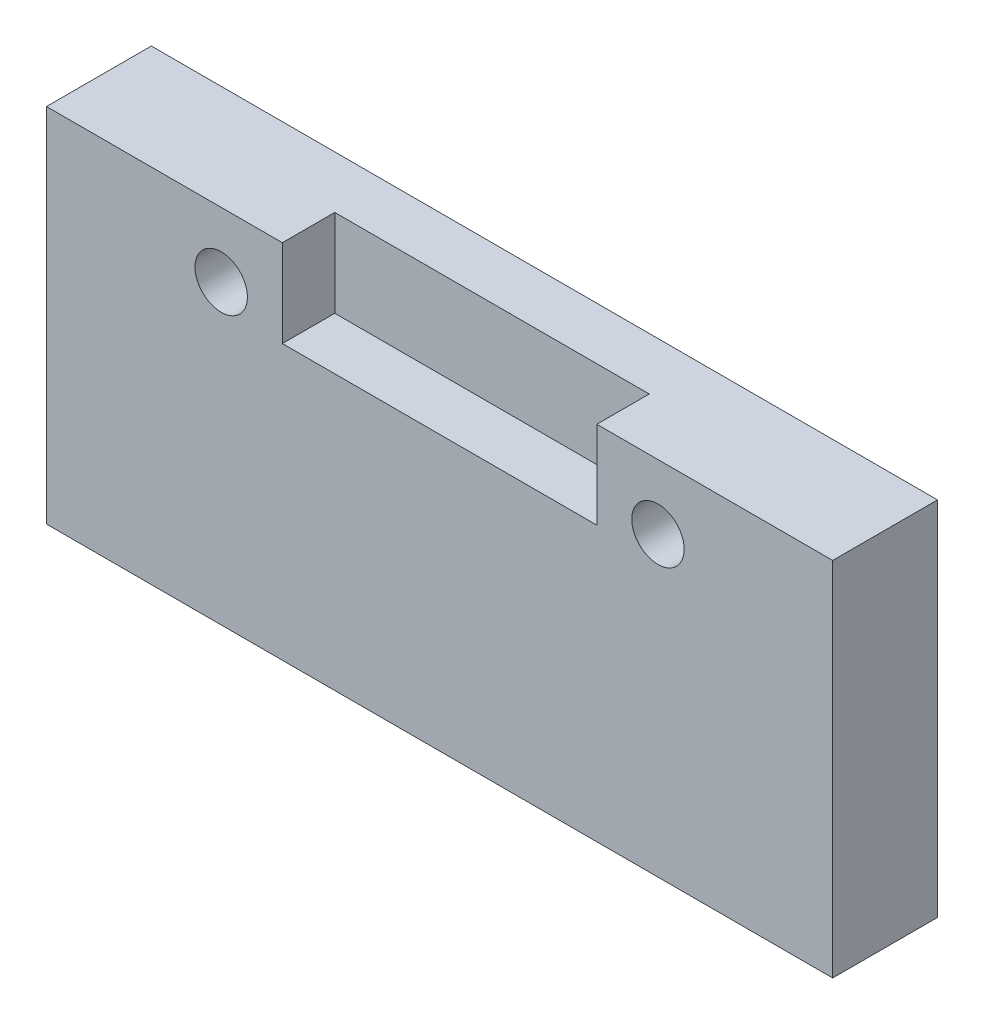
ISO-10303-21;
HEADER;
FILE_DESCRIPTION(('STEP AP214'),'2;1');
FILE_NAME('part.step','',(''),(''),'','','');
FILE_SCHEMA(('AUTOMOTIVE_DESIGN { 1 0 10303 214 1 1 1 1 }'));
ENDSEC;
DATA;
#1=APPLICATION_CONTEXT('core data for automotive mechanical design processes');
#2=APPLICATION_PROTOCOL_DEFINITION('international standard','automotive_design',2000,#1);
#3=PRODUCT_CONTEXT('',#1,'mechanical');
#4=PRODUCT('Part','Part','',(#3));
#5=PRODUCT_RELATED_PRODUCT_CATEGORY('part','',(#4));
#6=PRODUCT_DEFINITION_FORMATION('','',#4);
#7=PRODUCT_DEFINITION_CONTEXT('part definition',#1,'design');
#8=PRODUCT_DEFINITION('design','',#6,#7);
#9=PRODUCT_DEFINITION_SHAPE('','',#8);
#10=(LENGTH_UNIT() NAMED_UNIT(*) SI_UNIT(.MILLI.,.METRE.));
#11=(NAMED_UNIT(*) PLANE_ANGLE_UNIT() SI_UNIT($,.RADIAN.));
#12=(NAMED_UNIT(*) SI_UNIT($,.STERADIAN.) SOLID_ANGLE_UNIT());
#13=UNCERTAINTY_MEASURE_WITH_UNIT(LENGTH_MEASURE(1.E-05),#10,'distance_accuracy_value','');
#14=(GEOMETRIC_REPRESENTATION_CONTEXT(3) GLOBAL_UNCERTAINTY_ASSIGNED_CONTEXT((#13)) GLOBAL_UNIT_ASSIGNED_CONTEXT((#10,
#11,#12)) REPRESENTATION_CONTEXT('',''));
#15=CARTESIAN_POINT('',(0.,0.,0.));
#16=DIRECTION('',(0.,0.,1.));
#17=DIRECTION('',(1.,0.,0.));
#18=AXIS2_PLACEMENT_3D('',#15,#16,#17);
#19=CARTESIAN_POINT('',(0.,0.,6.));
#20=DIRECTION('',(0.,0.,1.));
#21=DIRECTION('',(1.,0.,0.));
#22=AXIS2_PLACEMENT_3D('',#19,#20,#21);
#23=PLANE('',#22);
#24=DIRECTION('',(0.,1.,0.));
#25=VECTOR('',#24,1.);
#26=CARTESIAN_POINT('',(13.0466141577248,7.20600717876717,6.));
#27=LINE('',#26,#25);
#28=CARTESIAN_POINT('',(13.0466141577248,7.20600717876717,6.));
#29=VERTEX_POINT('',#28);
#30=CARTESIAN_POINT('',(13.0466141577248,12.2060071787672,6.));
#31=VERTEX_POINT('',#30);
#32=EDGE_CURVE('E123',#29,#31,#27,.T.);
#33=ORIENTED_EDGE('',*,*,#32,.F.);
#34=DIRECTION('',(1.,0.,0.));
#35=VECTOR('',#34,1.);
#36=CARTESIAN_POINT('',(-4.95338584227521,7.20600717876717,6.));
#37=LINE('',#36,#35);
#38=CARTESIAN_POINT('',(-4.95338584227521,7.20600717876717,6.));
#39=VERTEX_POINT('',#38);
#40=EDGE_CURVE('E284',#39,#29,#37,.T.);
#41=ORIENTED_EDGE('',*,*,#40,.F.);
#42=DIRECTION('',(0.,-1.,0.));
#43=VECTOR('',#42,1.);
#44=CARTESIAN_POINT('',(-4.95338584227522,12.2060071787672,6.));
#45=LINE('',#44,#43);
#46=CARTESIAN_POINT('',(-4.95338584227522,12.2060071787672,6.));
#47=VERTEX_POINT('',#46);
#48=EDGE_CURVE('E289',#47,#39,#45,.T.);
#49=ORIENTED_EDGE('',*,*,#48,.F.);
#50=DIRECTION('',(-1.,0.,0.));
#51=VECTOR('',#50,1.);
#52=CARTESIAN_POINT('',(26.5466141577248,12.2060071787672,6.));
#53=LINE('',#52,#51);
#54=CARTESIAN_POINT('',(-18.4533858422752,12.2060071787672,6.));
#55=VERTEX_POINT('',#54);
#56=EDGE_CURVE('E85',#47,#55,#53,.T.);
#57=ORIENTED_EDGE('',*,*,#56,.T.);
#58=DIRECTION('',(0.,-1.,0.));
#59=VECTOR('',#58,1.);
#60=CARTESIAN_POINT('',(-18.4533858422752,12.2060071787672,6.));
#61=LINE('',#60,#59);
#62=CARTESIAN_POINT('',(-18.4533858422752,-8.49399282123283,6.));
#63=VERTEX_POINT('',#62);
#64=EDGE_CURVE('E148',#55,#63,#61,.T.);
#65=ORIENTED_EDGE('',*,*,#64,.T.);
#66=DIRECTION('',(1.,0.,0.));
#67=VECTOR('',#66,1.);
#68=CARTESIAN_POINT('',(-18.4533858422752,-8.49399282123283,6.));
#69=LINE('',#68,#67);
#70=CARTESIAN_POINT('',(26.5466141577248,-8.49399282123283,6.));
#71=VERTEX_POINT('',#70);
#72=EDGE_CURVE('E150',#63,#71,#69,.T.);
#73=ORIENTED_EDGE('',*,*,#72,.T.);
#74=DIRECTION('',(0.,1.,0.));
#75=VECTOR('',#74,1.);
#76=CARTESIAN_POINT('',(26.5466141577248,-8.49399282123283,6.));
#77=LINE('',#76,#75);
#78=CARTESIAN_POINT('',(26.5466141577248,12.2060071787672,6.));
#79=VERTEX_POINT('',#78);
#80=EDGE_CURVE('E57',#71,#79,#77,.T.);
#81=ORIENTED_EDGE('',*,*,#80,.T.);
#82=EDGE_CURVE('E146',#79,#31,#53,.T.);
#83=ORIENTED_EDGE('',*,*,#82,.T.);
#84=EDGE_LOOP('',(#33,#41,#49,#57,#65,#73,#81,#83));
#85=FACE_BOUND('',#84,.T.);
#86=CARTESIAN_POINT('',(16.5466141577248,8.50600717876716,6.));
#87=DIRECTION('',(0.,0.,1.));
#88=DIRECTION('',(1.,0.,0.));
#89=AXIS2_PLACEMENT_3D('',#86,#87,#88);
#90=CIRCLE('',#89,1.5);
#91=CARTESIAN_POINT('',(18.0466141577248,8.50600717876716,6.));
#92=VERTEX_POINT('',#91);
#93=EDGE_CURVE('E140',#92,#92,#90,.T.);
#94=ORIENTED_EDGE('',*,*,#93,.F.);
#95=EDGE_LOOP('',(#94));
#96=FACE_BOUND('',#95,.T.);
#97=CARTESIAN_POINT('',(-8.45338584227521,8.50600717876716,6.));
#98=DIRECTION('',(0.,0.,1.));
#99=DIRECTION('',(1.,0.,0.));
#100=AXIS2_PLACEMENT_3D('',#97,#98,#99);
#101=CIRCLE('',#100,1.5);
#102=CARTESIAN_POINT('',(-6.95338584227521,8.50600717876716,6.));
#103=VERTEX_POINT('',#102);
#104=EDGE_CURVE('E132',#103,#103,#101,.T.);
#105=ORIENTED_EDGE('',*,*,#104,.F.);
#106=EDGE_LOOP('',(#105));
#107=FACE_BOUND('',#106,.T.);
#108=ADVANCED_FACE('F33',(#85,#96,#107),#23,.T.);
#109=CARTESIAN_POINT('',(0.,0.,0.));
#110=DIRECTION('',(0.,0.,1.));
#111=DIRECTION('',(1.,0.,0.));
#112=AXIS2_PLACEMENT_3D('',#109,#110,#111);
#113=PLANE('',#112);
#114=DIRECTION('',(-1.,0.,0.));
#115=VECTOR('',#114,1.);
#116=CARTESIAN_POINT('',(26.5466141577248,12.2060071787672,0.));
#117=LINE('',#116,#115);
#118=CARTESIAN_POINT('',(26.5466141577248,12.2060071787672,0.));
#119=VERTEX_POINT('',#118);
#120=CARTESIAN_POINT('',(-18.4533858422752,12.2060071787672,0.));
#121=VERTEX_POINT('',#120);
#122=EDGE_CURVE('E143',#119,#121,#117,.T.);
#123=ORIENTED_EDGE('',*,*,#122,.F.);
#124=DIRECTION('',(0.,1.,0.));
#125=VECTOR('',#124,1.);
#126=CARTESIAN_POINT('',(26.5466141577248,-8.49399282123283,0.));
#127=LINE('',#126,#125);
#128=CARTESIAN_POINT('',(26.5466141577248,-8.49399282123283,0.));
#129=VERTEX_POINT('',#128);
#130=EDGE_CURVE('E78',#129,#119,#127,.T.);
#131=ORIENTED_EDGE('',*,*,#130,.F.);
#132=DIRECTION('',(1.,0.,0.));
#133=VECTOR('',#132,1.);
#134=CARTESIAN_POINT('',(-18.4533858422752,-8.49399282123283,0.));
#135=LINE('',#134,#133);
#136=CARTESIAN_POINT('',(-18.4533858422752,-8.49399282123283,0.));
#137=VERTEX_POINT('',#136);
#138=EDGE_CURVE('E158',#137,#129,#135,.T.);
#139=ORIENTED_EDGE('',*,*,#138,.F.);
#140=DIRECTION('',(0.,-1.,0.));
#141=VECTOR('',#140,1.);
#142=CARTESIAN_POINT('',(-18.4533858422752,12.2060071787672,0.));
#143=LINE('',#142,#141);
#144=EDGE_CURVE('E156',#121,#137,#143,.T.);
#145=ORIENTED_EDGE('',*,*,#144,.F.);
#146=EDGE_LOOP('',(#123,#131,#139,#145));
#147=FACE_BOUND('',#146,.T.);
#148=CARTESIAN_POINT('',(16.5466141577248,8.50600717876716,0.));
#149=DIRECTION('',(0.,0.,1.));
#150=DIRECTION('',(1.,0.,0.));
#151=AXIS2_PLACEMENT_3D('',#148,#149,#150);
#152=CIRCLE('',#151,1.5);
#153=CARTESIAN_POINT('',(18.0466141577248,8.50600717876716,0.));
#154=VERTEX_POINT('',#153);
#155=EDGE_CURVE('E135',#154,#154,#152,.T.);
#156=ORIENTED_EDGE('',*,*,#155,.T.);
#157=EDGE_LOOP('',(#156));
#158=FACE_BOUND('',#157,.T.);
#159=CARTESIAN_POINT('',(-8.45338584227521,8.50600717876716,0.));
#160=DIRECTION('',(0.,0.,1.));
#161=DIRECTION('',(1.,0.,0.));
#162=AXIS2_PLACEMENT_3D('',#159,#160,#161);
#163=CIRCLE('',#162,1.5);
#164=CARTESIAN_POINT('',(-6.95338584227521,8.50600717876716,0.));
#165=VERTEX_POINT('',#164);
#166=EDGE_CURVE('E136',#165,#165,#163,.T.);
#167=ORIENTED_EDGE('',*,*,#166,.T.);
#168=EDGE_LOOP('',(#167));
#169=FACE_BOUND('',#168,.T.);
#170=ADVANCED_FACE('F173',(#147,#158,#169),#113,.F.);
#171=CARTESIAN_POINT('',(26.5466141577248,12.2060071787672,6.));
#172=DIRECTION('',(0.,-1.,0.));
#173=DIRECTION('',(1.,0.,0.));
#174=AXIS2_PLACEMENT_3D('',#171,#172,#173);
#175=PLANE('',#174);
#176=DIRECTION('',(-1.,0.,0.));
#177=VECTOR('',#176,1.);
#178=CARTESIAN_POINT('',(13.0466141577248,12.2060071787672,3.));
#179=LINE('',#178,#177);
#180=CARTESIAN_POINT('',(13.0466141577248,12.2060071787672,3.));
#181=VERTEX_POINT('',#180);
#182=CARTESIAN_POINT('',(-4.95338584227522,12.2060071787672,3.));
#183=VERTEX_POINT('',#182);
#184=EDGE_CURVE('E117',#181,#183,#179,.T.);
#185=ORIENTED_EDGE('',*,*,#184,.F.);
#186=DIRECTION('',(0.,0.,1.));
#187=VECTOR('',#186,1.);
#188=CARTESIAN_POINT('',(13.0466141577248,12.2060071787672,3.));
#189=LINE('',#188,#187);
#190=EDGE_CURVE('E139',#181,#31,#189,.T.);
#191=ORIENTED_EDGE('',*,*,#190,.T.);
#192=ORIENTED_EDGE('',*,*,#82,.F.);
#193=DIRECTION('',(0.,0.,-1.));
#194=VECTOR('',#193,1.);
#195=CARTESIAN_POINT('',(26.5466141577248,12.2060071787672,6.));
#196=LINE('',#195,#194);
#197=EDGE_CURVE('E153',#79,#119,#196,.T.);
#198=ORIENTED_EDGE('',*,*,#197,.T.);
#199=ORIENTED_EDGE('',*,*,#122,.T.);
#200=DIRECTION('',(0.,0.,-1.));
#201=VECTOR('',#200,1.);
#202=CARTESIAN_POINT('',(-18.4533858422752,12.2060071787672,6.));
#203=LINE('',#202,#201);
#204=EDGE_CURVE('E11',#55,#121,#203,.T.);
#205=ORIENTED_EDGE('',*,*,#204,.F.);
#206=ORIENTED_EDGE('',*,*,#56,.F.);
#207=DIRECTION('',(0.,0.,1.));
#208=VECTOR('',#207,1.);
#209=CARTESIAN_POINT('',(-4.95338584227522,12.2060071787672,3.));
#210=LINE('',#209,#208);
#211=EDGE_CURVE('E113',#183,#47,#210,.T.);
#212=ORIENTED_EDGE('',*,*,#211,.F.);
#213=EDGE_LOOP('',(#185,#191,#192,#198,#199,#205,#206,#212));
#214=FACE_BOUND('',#213,.T.);
#215=ADVANCED_FACE('F35',(#214),#175,.F.);
#216=CARTESIAN_POINT('',(-18.4533858422752,12.2060071787672,6.));
#217=DIRECTION('',(1.,0.,0.));
#218=DIRECTION('',(0.,0.,-1.));
#219=AXIS2_PLACEMENT_3D('',#216,#217,#218);
#220=PLANE('',#219);
#221=ORIENTED_EDGE('',*,*,#144,.T.);
#222=DIRECTION('',(0.,0.,-1.));
#223=VECTOR('',#222,1.);
#224=CARTESIAN_POINT('',(-18.4533858422752,-8.49399282123283,6.));
#225=LINE('',#224,#223);
#226=EDGE_CURVE('E41',#63,#137,#225,.T.);
#227=ORIENTED_EDGE('',*,*,#226,.F.);
#228=ORIENTED_EDGE('',*,*,#64,.F.);
#229=ORIENTED_EDGE('',*,*,#204,.T.);
#230=EDGE_LOOP('',(#221,#227,#228,#229));
#231=FACE_BOUND('',#230,.T.);
#232=ADVANCED_FACE('F187',(#231),#220,.F.);
#233=CARTESIAN_POINT('',(-18.4533858422752,-8.49399282123283,6.));
#234=DIRECTION('',(0.,1.,0.));
#235=DIRECTION('',(0.,0.,1.));
#236=AXIS2_PLACEMENT_3D('',#233,#234,#235);
#237=PLANE('',#236);
#238=ORIENTED_EDGE('',*,*,#138,.T.);
#239=DIRECTION('',(0.,0.,-1.));
#240=VECTOR('',#239,1.);
#241=CARTESIAN_POINT('',(26.5466141577248,-8.49399282123283,6.));
#242=LINE('',#241,#240);
#243=EDGE_CURVE('E162',#71,#129,#242,.T.);
#244=ORIENTED_EDGE('',*,*,#243,.F.);
#245=ORIENTED_EDGE('',*,*,#72,.F.);
#246=ORIENTED_EDGE('',*,*,#226,.T.);
#247=EDGE_LOOP('',(#238,#244,#245,#246));
#248=FACE_BOUND('',#247,.T.);
#249=ADVANCED_FACE('F168',(#248),#237,.F.);
#250=CARTESIAN_POINT('',(26.5466141577248,-8.49399282123283,6.));
#251=DIRECTION('',(-1.,0.,0.));
#252=DIRECTION('',(0.,0.,1.));
#253=AXIS2_PLACEMENT_3D('',#250,#251,#252);
#254=PLANE('',#253);
#255=ORIENTED_EDGE('',*,*,#130,.T.);
#256=ORIENTED_EDGE('',*,*,#197,.F.);
#257=ORIENTED_EDGE('',*,*,#80,.F.);
#258=ORIENTED_EDGE('',*,*,#243,.T.);
#259=EDGE_LOOP('',(#255,#256,#257,#258));
#260=FACE_BOUND('',#259,.T.);
#261=ADVANCED_FACE('F176',(#260),#254,.F.);
#262=CARTESIAN_POINT('',(16.5466141577248,8.50600717876716,6.));
#263=DIRECTION('',(0.,0.,-1.));
#264=DIRECTION('',(-1.,0.,0.));
#265=AXIS2_PLACEMENT_3D('',#262,#263,#264);
#266=CYLINDRICAL_SURFACE('',#265,1.5);
#267=ORIENTED_EDGE('',*,*,#93,.T.);
#268=EDGE_LOOP('',(#267));
#269=FACE_BOUND('',#268,.T.);
#270=ORIENTED_EDGE('',*,*,#155,.F.);
#271=EDGE_LOOP('',(#270));
#272=FACE_BOUND('',#271,.T.);
#273=ADVANCED_FACE('F178',(#269,#272),#266,.F.);
#274=CARTESIAN_POINT('',(-8.45338584227521,8.50600717876716,6.));
#275=DIRECTION('',(0.,0.,-1.));
#276=DIRECTION('',(-1.,0.,0.));
#277=AXIS2_PLACEMENT_3D('',#274,#275,#276);
#278=CYLINDRICAL_SURFACE('',#277,1.5);
#279=ORIENTED_EDGE('',*,*,#104,.T.);
#280=EDGE_LOOP('',(#279));
#281=FACE_BOUND('',#280,.T.);
#282=ORIENTED_EDGE('',*,*,#166,.F.);
#283=EDGE_LOOP('',(#282));
#284=FACE_BOUND('',#283,.T.);
#285=ADVANCED_FACE('F184',(#281,#284),#278,.F.);
#286=CARTESIAN_POINT('',(13.0466141577248,7.20600717876717,3.));
#287=DIRECTION('',(1.,0.,0.));
#288=DIRECTION('',(0.,1.,0.));
#289=AXIS2_PLACEMENT_3D('',#286,#287,#288);
#290=PLANE('',#289);
#291=ORIENTED_EDGE('',*,*,#32,.T.);
#292=ORIENTED_EDGE('',*,*,#190,.F.);
#293=DIRECTION('',(0.,1.,0.));
#294=VECTOR('',#293,1.);
#295=CARTESIAN_POINT('',(13.0466141577248,7.20600717876717,3.));
#296=LINE('',#295,#294);
#297=CARTESIAN_POINT('',(13.0466141577248,7.20600717876717,3.));
#298=VERTEX_POINT('',#297);
#299=EDGE_CURVE('E48',#298,#181,#296,.T.);
#300=ORIENTED_EDGE('',*,*,#299,.F.);
#301=DIRECTION('',(0.,0.,1.));
#302=VECTOR('',#301,1.);
#303=CARTESIAN_POINT('',(13.0466141577248,7.20600717876717,3.));
#304=LINE('',#303,#302);
#305=EDGE_CURVE('E127',#298,#29,#304,.T.);
#306=ORIENTED_EDGE('',*,*,#305,.T.);
#307=EDGE_LOOP('',(#291,#292,#300,#306));
#308=FACE_BOUND('',#307,.T.);
#309=ADVANCED_FACE('F200',(#308),#290,.F.);
#310=CARTESIAN_POINT('',(-4.95338584227521,7.20600717876717,3.));
#311=DIRECTION('',(0.,-1.,0.));
#312=DIRECTION('',(0.,0.,-1.));
#313=AXIS2_PLACEMENT_3D('',#310,#311,#312);
#314=PLANE('',#313);
#315=ORIENTED_EDGE('',*,*,#40,.T.);
#316=ORIENTED_EDGE('',*,*,#305,.F.);
#317=DIRECTION('',(1.,0.,0.));
#318=VECTOR('',#317,1.);
#319=CARTESIAN_POINT('',(-4.95338584227521,7.20600717876717,3.));
#320=LINE('',#319,#318);
#321=CARTESIAN_POINT('',(-4.95338584227521,7.20600717876717,3.));
#322=VERTEX_POINT('',#321);
#323=EDGE_CURVE('E116',#322,#298,#320,.T.);
#324=ORIENTED_EDGE('',*,*,#323,.F.);
#325=DIRECTION('',(0.,0.,1.));
#326=VECTOR('',#325,1.);
#327=CARTESIAN_POINT('',(-4.95338584227521,7.20600717876717,3.));
#328=LINE('',#327,#326);
#329=EDGE_CURVE('E114',#322,#39,#328,.T.);
#330=ORIENTED_EDGE('',*,*,#329,.T.);
#331=EDGE_LOOP('',(#315,#316,#324,#330));
#332=FACE_BOUND('',#331,.T.);
#333=ADVANCED_FACE('F204',(#332),#314,.F.);
#334=CARTESIAN_POINT('',(-4.95338584227522,12.2060071787672,3.));
#335=DIRECTION('',(-1.,0.,0.));
#336=DIRECTION('',(0.,-1.,0.));
#337=AXIS2_PLACEMENT_3D('',#334,#335,#336);
#338=PLANE('',#337);
#339=ORIENTED_EDGE('',*,*,#48,.T.);
#340=ORIENTED_EDGE('',*,*,#329,.F.);
#341=DIRECTION('',(0.,-1.,0.));
#342=VECTOR('',#341,1.);
#343=CARTESIAN_POINT('',(-4.95338584227522,12.2060071787672,3.));
#344=LINE('',#343,#342);
#345=EDGE_CURVE('E109',#183,#322,#344,.T.);
#346=ORIENTED_EDGE('',*,*,#345,.F.);
#347=ORIENTED_EDGE('',*,*,#211,.T.);
#348=EDGE_LOOP('',(#339,#340,#346,#347));
#349=FACE_BOUND('',#348,.T.);
#350=ADVANCED_FACE('F111',(#349),#338,.F.);
#351=CARTESIAN_POINT('',(0.,0.,3.));
#352=DIRECTION('',(0.,0.,1.));
#353=DIRECTION('',(1.,0.,0.));
#354=AXIS2_PLACEMENT_3D('',#351,#352,#353);
#355=PLANE('',#354);
#356=ORIENTED_EDGE('',*,*,#184,.T.);
#357=ORIENTED_EDGE('',*,*,#345,.T.);
#358=ORIENTED_EDGE('',*,*,#323,.T.);
#359=ORIENTED_EDGE('',*,*,#299,.T.);
#360=EDGE_LOOP('',(#356,#357,#358,#359));
#361=FACE_BOUND('',#360,.T.);
#362=ADVANCED_FACE('F120',(#361),#355,.T.);
#363=CLOSED_SHELL('',(#108,#170,#215,#232,#249,#261,#273,#285,#309,#333,#350,#362));
#364=MANIFOLD_SOLID_BREP('B2',#363);
#365=ADVANCED_BREP_SHAPE_REPRESENTATION('',(#18,#364),#14);
#366=SHAPE_DEFINITION_REPRESENTATION(#9,#365);
ENDSEC;
END-ISO-10303-21;
